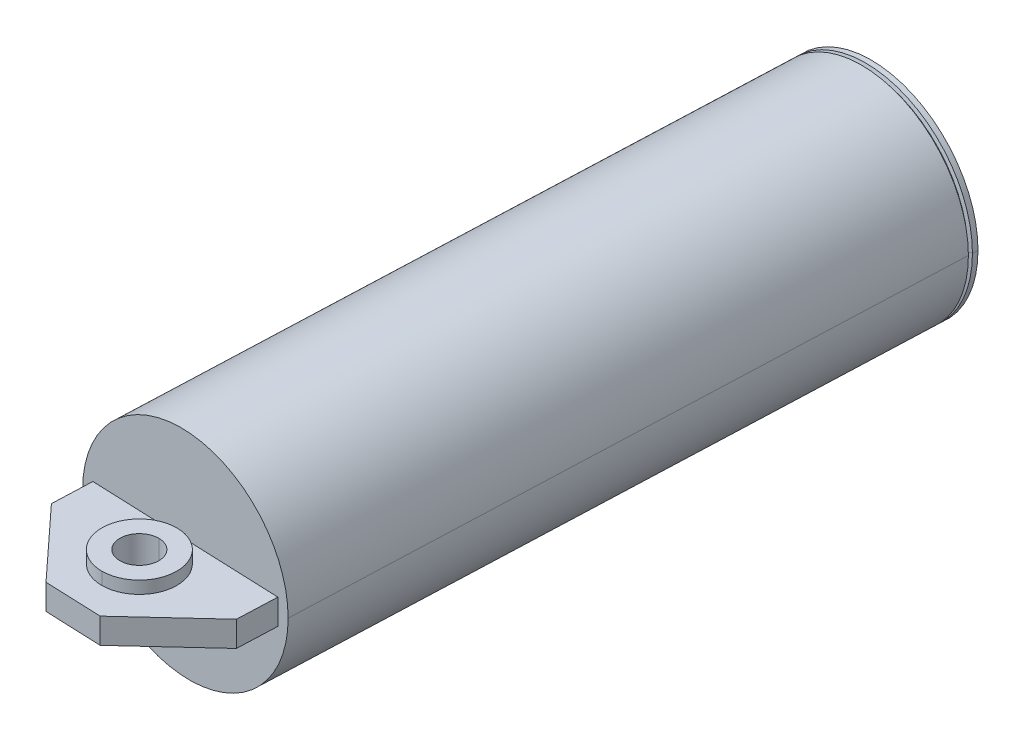
ISO-10303-21;
HEADER;
FILE_DESCRIPTION(('STEP AP214'),'2;1');
FILE_NAME('part.step','',(''),(''),'','','');
FILE_SCHEMA(('AUTOMOTIVE_DESIGN { 1 0 10303 214 1 1 1 1 }'));
ENDSEC;
DATA;
#1=APPLICATION_CONTEXT('core data for automotive mechanical design processes');
#2=APPLICATION_PROTOCOL_DEFINITION('international standard','automotive_design',2000,#1);
#3=PRODUCT_CONTEXT('',#1,'mechanical');
#4=PRODUCT('Part','Part','',(#3));
#5=PRODUCT_RELATED_PRODUCT_CATEGORY('part','',(#4));
#6=PRODUCT_DEFINITION_FORMATION('','',#4);
#7=PRODUCT_DEFINITION_CONTEXT('part definition',#1,'design');
#8=PRODUCT_DEFINITION('design','',#6,#7);
#9=PRODUCT_DEFINITION_SHAPE('','',#8);
#10=(LENGTH_UNIT() NAMED_UNIT(*) SI_UNIT(.MILLI.,.METRE.));
#11=(NAMED_UNIT(*) PLANE_ANGLE_UNIT() SI_UNIT($,.RADIAN.));
#12=(NAMED_UNIT(*) SI_UNIT($,.STERADIAN.) SOLID_ANGLE_UNIT());
#13=UNCERTAINTY_MEASURE_WITH_UNIT(LENGTH_MEASURE(1.E-05),#10,'distance_accuracy_value','');
#14=(GEOMETRIC_REPRESENTATION_CONTEXT(3) GLOBAL_UNCERTAINTY_ASSIGNED_CONTEXT((#13)) GLOBAL_UNIT_ASSIGNED_CONTEXT((#10,
#11,#12)) REPRESENTATION_CONTEXT('',''));
#15=CARTESIAN_POINT('',(0.,0.,0.));
#16=DIRECTION('',(0.,0.,1.));
#17=DIRECTION('',(1.,0.,0.));
#18=AXIS2_PLACEMENT_3D('',#15,#16,#17);
#19=CARTESIAN_POINT('',(328.520012892394,269.249999999995,1362.56665197064));
#20=DIRECTION('',(0.0397214660591929,0.,-0.999210791141743));
#21=DIRECTION('',(0.,-1.,0.));
#22=AXIS2_PLACEMENT_3D('',#19,#20,#21);
#23=PLANE('',#22);
#24=CARTESIAN_POINT('',(328.520012892394,269.249999999995,1362.56665197064));
#25=DIRECTION('',(0.0397214660591949,0.,-0.999210791141743));
#26=DIRECTION('',(0.999210791141743,0.,0.0397214660591949));
#27=AXIS2_PLACEMENT_3D('',#24,#25,#26);
#28=CIRCLE('',#27,50.);
#29=CARTESIAN_POINT('',(378.480552449482,269.249999999995,1364.5527252736));
#30=VERTEX_POINT('',#29);
#31=CARTESIAN_POINT('',(278.559473335308,269.249999999995,1360.58057866768));
#32=VERTEX_POINT('',#31);
#33=EDGE_CURVE('E362',#30,#32,#28,.T.);
#34=ORIENTED_EDGE('',*,*,#33,.T.);
#35=CARTESIAN_POINT('',(328.520012892394,269.249999999995,1362.56665197064));
#36=DIRECTION('',(0.0397214660591949,0.,-0.999210791141743));
#37=DIRECTION('',(0.999210791141743,0.,0.0397214660591949));
#38=AXIS2_PLACEMENT_3D('',#35,#36,#37);
#39=CIRCLE('',#38,50.);
#40=EDGE_CURVE('E9',#32,#30,#39,.T.);
#41=ORIENTED_EDGE('',*,*,#40,.T.);
#42=EDGE_LOOP('',(#34,#41));
#43=FACE_BOUND('',#42,.T.);
#44=ADVANCED_FACE('F16',(#43),#23,.T.);
#45=CARTESIAN_POINT('',(328.142658964832,269.249999999995,1372.05915448649));
#46=DIRECTION('',(-0.0397214660591949,0.,0.999210791141743));
#47=DIRECTION('',(0.999210791141743,0.,0.0397214660591949));
#48=AXIS2_PLACEMENT_3D('',#45,#46,#47);
#49=CYLINDRICAL_SURFACE('',#48,50.);
#50=DIRECTION('',(-0.0397214660591929,0.,0.999210791141743));
#51=VECTOR('',#50,1.);
#52=CARTESIAN_POINT('',(278.182119407745,269.249999999995,1370.07308118353));
#53=LINE('',#52,#51);
#54=CARTESIAN_POINT('',(278.74219207918,269.249999999995,1355.98420902843));
#55=VERTEX_POINT('',#54);
#56=EDGE_CURVE('E367',#55,#32,#53,.T.);
#57=ORIENTED_EDGE('',*,*,#56,.F.);
#58=CARTESIAN_POINT('',(328.702731636267,269.249999999995,1357.97028233139));
#59=DIRECTION('',(0.0397214660591949,0.,-0.999210791141743));
#60=DIRECTION('',(0.999210791141743,0.,0.0397214660591949));
#61=AXIS2_PLACEMENT_3D('',#58,#59,#60);
#62=CIRCLE('',#61,50.);
#63=CARTESIAN_POINT('',(378.663271193354,269.249999999995,1359.95635563435));
#64=VERTEX_POINT('',#63);
#65=EDGE_CURVE('E19',#55,#64,#62,.T.);
#66=ORIENTED_EDGE('',*,*,#65,.T.);
#67=DIRECTION('',(-0.0397214660591929,0.,0.999210791141743));
#68=VECTOR('',#67,1.);
#69=CARTESIAN_POINT('',(378.103198521919,269.249999999995,1374.04522778945));
#70=LINE('',#69,#68);
#71=EDGE_CURVE('E366',#64,#30,#70,.T.);
#72=ORIENTED_EDGE('',*,*,#71,.T.);
#73=ORIENTED_EDGE('',*,*,#40,.F.);
#74=EDGE_LOOP('',(#57,#66,#72,#73));
#75=FACE_BOUND('',#74,.T.);
#76=ADVANCED_FACE('F487',(#75),#49,.F.);
#77=CARTESIAN_POINT('',(356.218422899603,313.536711066785,1359.06410918584));
#78=DIRECTION('',(-0.0397214660591928,0.,0.999210791141743));
#79=DIRECTION('',(0.,1.,0.));
#80=AXIS2_PLACEMENT_3D('',#77,#78,#79);
#81=PLANE('',#80);
#82=CARTESIAN_POINT('',(328.702731636267,269.249999999995,1357.97028233139));
#83=DIRECTION('',(0.0397214660591949,0.,-0.999210791141743));
#84=DIRECTION('',(0.999210791141743,0.,0.0397214660591949));
#85=AXIS2_PLACEMENT_3D('',#82,#83,#84);
#86=CIRCLE('',#85,50.);
#87=EDGE_CURVE('E317',#64,#55,#86,.T.);
#88=ORIENTED_EDGE('',*,*,#87,.F.);
#89=ORIENTED_EDGE('',*,*,#65,.F.);
#90=EDGE_LOOP('',(#88,#89));
#91=FACE_BOUND('',#90,.T.);
#92=CARTESIAN_POINT('',(328.702731636267,269.249999999995,1357.97028233139));
#93=DIRECTION('',(0.0397214660591948,0.,-0.999210791141743));
#94=DIRECTION('',(0.999210791141743,0.,0.0397214660591948));
#95=AXIS2_PLACEMENT_3D('',#92,#93,#94);
#96=CIRCLE('',#95,52.15);
#97=CARTESIAN_POINT('',(380.811574394309,269.249999999995,1360.04175678637));
#98=VERTEX_POINT('',#97);
#99=CARTESIAN_POINT('',(276.593888878225,269.249999999995,1355.8988078764));
#100=VERTEX_POINT('',#99);
#101=EDGE_CURVE('E318',#98,#100,#96,.T.);
#102=ORIENTED_EDGE('',*,*,#101,.T.);
#103=CARTESIAN_POINT('',(328.702731636267,269.249999999995,1357.97028233139));
#104=DIRECTION('',(0.0397214660591948,0.,-0.999210791141743));
#105=DIRECTION('',(0.999210791141743,0.,0.0397214660591948));
#106=AXIS2_PLACEMENT_3D('',#103,#104,#105);
#107=CIRCLE('',#106,52.15);
#108=EDGE_CURVE('E476',#100,#98,#107,.T.);
#109=ORIENTED_EDGE('',*,*,#108,.T.);
#110=EDGE_LOOP('',(#102,#109));
#111=FACE_BOUND('',#110,.T.);
#112=ADVANCED_FACE('F493',(#91,#111),#81,.F.);
#113=CARTESIAN_POINT('',(328.142658964832,269.249999999995,1372.05915448649));
#114=DIRECTION('',(-0.0397214660591948,0.,0.999210791141743));
#115=DIRECTION('',(0.999210791141743,0.,0.0397214660591948));
#116=AXIS2_PLACEMENT_3D('',#113,#114,#115);
#117=CYLINDRICAL_SURFACE('',#116,52.15);
#118=DIRECTION('',(-0.0397214660591929,0.,0.999210791141743));
#119=VECTOR('',#118,1.);
#120=CARTESIAN_POINT('',(276.03381620679,269.249999999995,1369.9876800315));
#121=LINE('',#120,#119);
#122=CARTESIAN_POINT('',(276.709081129797,269.249999999995,1353.00109658209));
#123=VERTEX_POINT('',#122);
#124=EDGE_CURVE('E387',#123,#100,#121,.T.);
#125=ORIENTED_EDGE('',*,*,#124,.F.);
#126=CARTESIAN_POINT('',(328.817923887839,269.249999999995,1355.07257103708));
#127=DIRECTION('',(0.0397214660591948,0.,-0.999210791141743));
#128=DIRECTION('',(0.999210791141743,0.,0.0397214660591948));
#129=AXIS2_PLACEMENT_3D('',#126,#127,#128);
#130=CIRCLE('',#129,52.15);
#131=CARTESIAN_POINT('',(380.926766645881,269.249999999995,1357.14404549206));
#132=VERTEX_POINT('',#131);
#133=EDGE_CURVE('E473',#123,#132,#130,.T.);
#134=ORIENTED_EDGE('',*,*,#133,.T.);
#135=DIRECTION('',(-0.0397214660591929,0.,0.999210791141743));
#136=VECTOR('',#135,1.);
#137=CARTESIAN_POINT('',(380.251501722874,269.249999999995,1374.13062894147));
#138=LINE('',#137,#136);
#139=EDGE_CURVE('E313',#132,#98,#138,.T.);
#140=ORIENTED_EDGE('',*,*,#139,.T.);
#141=ORIENTED_EDGE('',*,*,#108,.F.);
#142=EDGE_LOOP('',(#125,#134,#140,#141));
#143=FACE_BOUND('',#142,.T.);
#144=ADVANCED_FACE('F495',(#143),#117,.F.);
#145=CARTESIAN_POINT('',(355.726845353421,312.56011053511,1356.14227706924));
#146=DIRECTION('',(0.0397214660591928,0.,-0.999210791141743));
#147=DIRECTION('',(0.,-1.,0.));
#148=AXIS2_PLACEMENT_3D('',#145,#146,#147);
#149=PLANE('',#148);
#150=CARTESIAN_POINT('',(328.817923887839,269.249999999995,1355.07257103708));
#151=DIRECTION('',(0.0397214660591914,0.,-0.999210791141743));
#152=DIRECTION('',(0.999210791141743,0.,0.0397214660591914));
#153=AXIS2_PLACEMENT_3D('',#150,#151,#152);
#154=CIRCLE('',#153,51.);
#155=CARTESIAN_POINT('',(379.777674236068,269.249999999995,1357.0983658061));
#156=VERTEX_POINT('',#155);
#157=CARTESIAN_POINT('',(277.85817353961,269.249999999995,1353.04677626806));
#158=VERTEX_POINT('',#157);
#159=EDGE_CURVE('E378',#156,#158,#154,.T.);
#160=ORIENTED_EDGE('',*,*,#159,.T.);
#161=CARTESIAN_POINT('',(328.817923887839,269.249999999995,1355.07257103708));
#162=DIRECTION('',(0.0397214660591914,0.,-0.999210791141743));
#163=DIRECTION('',(0.999210791141743,0.,0.0397214660591914));
#164=AXIS2_PLACEMENT_3D('',#161,#162,#163);
#165=CIRCLE('',#164,51.);
#166=EDGE_CURVE('E470',#158,#156,#165,.T.);
#167=ORIENTED_EDGE('',*,*,#166,.T.);
#168=EDGE_LOOP('',(#160,#167));
#169=FACE_BOUND('',#168,.T.);
#170=CARTESIAN_POINT('',(328.817923887839,269.249999999995,1355.07257103708));
#171=DIRECTION('',(0.0397214660591948,0.,-0.999210791141743));
#172=DIRECTION('',(0.999210791141743,0.,0.0397214660591948));
#173=AXIS2_PLACEMENT_3D('',#170,#171,#172);
#174=CIRCLE('',#173,52.15);
#175=EDGE_CURVE('E383',#132,#123,#174,.T.);
#176=ORIENTED_EDGE('',*,*,#175,.F.);
#177=ORIENTED_EDGE('',*,*,#133,.F.);
#178=EDGE_LOOP('',(#176,#177));
#179=FACE_BOUND('',#178,.T.);
#180=ADVANCED_FACE('F505',(#169,#179),#149,.F.);
#181=CARTESIAN_POINT('',(300.000000261894,243.999999999992,2080.00000001041));
#182=DIRECTION('',(0.,-1.,0.));
#183=DIRECTION('',(0.,0.,-1.));
#184=AXIS2_PLACEMENT_3D('',#181,#182,#183);
#185=PLANE('',#184);
#186=CARTESIAN_POINT('',(300.000000261894,243.999999999992,2080.00000001041));
#187=DIRECTION('',(0.,1.,0.));
#188=DIRECTION('',(0.,0.,-1.));
#189=AXIS2_PLACEMENT_3D('',#186,#187,#188);
#190=CIRCLE('',#189,20.);
#191=CARTESIAN_POINT('',(300.000000261894,243.999999999993,2060.00000001041));
#192=VERTEX_POINT('',#191);
#193=CARTESIAN_POINT('',(300.000000261894,243.999999999992,2100.00000001041));
#194=VERTEX_POINT('',#193);
#195=EDGE_CURVE('E346',#192,#194,#190,.T.);
#196=ORIENTED_EDGE('',*,*,#195,.T.);
#197=CARTESIAN_POINT('',(300.000000261894,243.999999999992,2080.00000001041));
#198=DIRECTION('',(0.,1.,0.));
#199=DIRECTION('',(0.,0.,-1.));
#200=AXIS2_PLACEMENT_3D('',#197,#198,#199);
#201=CIRCLE('',#200,20.);
#202=EDGE_CURVE('E394',#194,#192,#201,.T.);
#203=ORIENTED_EDGE('',*,*,#202,.T.);
#204=EDGE_LOOP('',(#196,#203));
#205=FACE_BOUND('',#204,.T.);
#206=CARTESIAN_POINT('',(300.000000261894,243.999999999992,2080.00000001041));
#207=DIRECTION('',(0.,1.,0.));
#208=DIRECTION('',(0.,0.,1.));
#209=AXIS2_PLACEMENT_3D('',#206,#207,#208);
#210=CIRCLE('',#209,27.5);
#211=CARTESIAN_POINT('',(300.000000261894,243.999999999992,2107.50000001041));
#212=VERTEX_POINT('',#211);
#213=CARTESIAN_POINT('',(300.000000261894,243.999999999993,2052.50000001041));
#214=VERTEX_POINT('',#213);
#215=EDGE_CURVE('E327',#212,#214,#210,.T.);
#216=ORIENTED_EDGE('',*,*,#215,.F.);
#217=CARTESIAN_POINT('',(300.000000261894,243.999999999992,2080.00000001041));
#218=DIRECTION('',(0.,1.,0.));
#219=DIRECTION('',(0.,0.,1.));
#220=AXIS2_PLACEMENT_3D('',#217,#218,#219);
#221=CIRCLE('',#220,27.5);
#222=EDGE_CURVE('E474',#214,#212,#221,.T.);
#223=ORIENTED_EDGE('',*,*,#222,.F.);
#224=EDGE_LOOP('',(#216,#223));
#225=FACE_BOUND('',#224,.T.);
#226=ADVANCED_FACE('F507',(#205,#225),#185,.T.);
#227=CARTESIAN_POINT('',(328.142658964832,269.249999999995,1372.05915448649));
#228=DIRECTION('',(-0.0397214660591914,0.,0.999210791141743));
#229=DIRECTION('',(0.999210791141743,0.,0.0397214660591914));
#230=AXIS2_PLACEMENT_3D('',#227,#228,#229);
#231=CYLINDRICAL_SURFACE('',#230,51.);
#232=DIRECTION('',(-0.0397214660591929,0.,0.999210791141743));
#233=VECTOR('',#232,1.);
#234=CARTESIAN_POINT('',(277.182908616603,269.249999999995,1370.03335971747));
#235=LINE('',#234,#233);
#236=CARTESIAN_POINT('',(277.937616471728,269.249999999995,1351.04835468577));
#237=VERTEX_POINT('',#236);
#238=EDGE_CURVE('E371',#237,#158,#235,.T.);
#239=ORIENTED_EDGE('',*,*,#238,.F.);
#240=CARTESIAN_POINT('',(328.897366819957,269.249999999995,1353.07414945479));
#241=DIRECTION('',(0.0397214660591914,0.,-0.999210791141743));
#242=DIRECTION('',(0.999210791141743,0.,0.0397214660591914));
#243=AXIS2_PLACEMENT_3D('',#240,#241,#242);
#244=CIRCLE('',#243,51.);
#245=CARTESIAN_POINT('',(379.857117168186,269.249999999995,1355.09994422381));
#246=VERTEX_POINT('',#245);
#247=EDGE_CURVE('E391',#237,#246,#244,.T.);
#248=ORIENTED_EDGE('',*,*,#247,.T.);
#249=DIRECTION('',(-0.0397214660591929,0.,0.999210791141743));
#250=VECTOR('',#249,1.);
#251=CARTESIAN_POINT('',(379.102409313061,269.249999999995,1374.0849492555));
#252=LINE('',#251,#250);
#253=EDGE_CURVE('E379',#246,#156,#252,.T.);
#254=ORIENTED_EDGE('',*,*,#253,.T.);
#255=ORIENTED_EDGE('',*,*,#166,.F.);
#256=EDGE_LOOP('',(#239,#248,#254,#255));
#257=FACE_BOUND('',#256,.T.);
#258=ADVANCED_FACE('F515',(#257),#231,.F.);
#259=CARTESIAN_POINT('',(300.000000261894,243.999999999992,2080.00000001041));
#260=DIRECTION('',(0.,1.,0.));
#261=DIRECTION('',(0.,0.,1.));
#262=AXIS2_PLACEMENT_3D('',#259,#260,#261);
#263=CYLINDRICAL_SURFACE('',#262,27.5);
#264=DIRECTION('',(0.,1.,0.));
#265=VECTOR('',#264,1.);
#266=CARTESIAN_POINT('',(300.000000261894,243.999999999993,2052.50000001041));
#267=LINE('',#266,#265);
#268=CARTESIAN_POINT('',(300.000000261894,248.999999999993,2052.50000001041));
#269=VERTEX_POINT('',#268);
#270=EDGE_CURVE('E331',#214,#269,#267,.T.);
#271=ORIENTED_EDGE('',*,*,#270,.F.);
#272=ORIENTED_EDGE('',*,*,#222,.T.);
#273=DIRECTION('',(0.,1.,0.));
#274=VECTOR('',#273,1.);
#275=CARTESIAN_POINT('',(300.000000261894,243.999999999992,2107.50000001041));
#276=LINE('',#275,#274);
#277=CARTESIAN_POINT('',(300.000000261894,248.999999999992,2107.50000001041));
#278=VERTEX_POINT('',#277);
#279=EDGE_CURVE('E357',#212,#278,#276,.T.);
#280=ORIENTED_EDGE('',*,*,#279,.T.);
#281=CARTESIAN_POINT('',(300.000000261894,248.999999999993,2080.00000001041));
#282=DIRECTION('',(0.,1.,0.));
#283=DIRECTION('',(0.,0.,1.));
#284=AXIS2_PLACEMENT_3D('',#281,#282,#283);
#285=CIRCLE('',#284,27.5);
#286=EDGE_CURVE('E395',#269,#278,#285,.T.);
#287=ORIENTED_EDGE('',*,*,#286,.F.);
#288=EDGE_LOOP('',(#271,#272,#280,#287));
#289=FACE_BOUND('',#288,.T.);
#290=ADVANCED_FACE('F556',(#289),#263,.T.);
#291=CARTESIAN_POINT('',(300.000000261894,282.249999999993,2080.00000001041));
#292=DIRECTION('',(0.,-1.,0.));
#293=DIRECTION('',(0.,0.,-1.));
#294=AXIS2_PLACEMENT_3D('',#291,#292,#293);
#295=CYLINDRICAL_SURFACE('',#294,20.);
#296=DIRECTION('',(0.,-1.,0.));
#297=VECTOR('',#296,1.);
#298=CARTESIAN_POINT('',(300.000000261894,282.249999999993,2100.00000001041));
#299=LINE('',#298,#297);
#300=CARTESIAN_POINT('',(300.000000261894,294.999999999992,2100.00000001041));
#301=VERTEX_POINT('',#300);
#302=EDGE_CURVE('E342',#301,#194,#299,.T.);
#303=ORIENTED_EDGE('',*,*,#302,.F.);
#304=CARTESIAN_POINT('',(300.000000261894,294.999999999992,2080.00000001041));
#305=DIRECTION('',(0.,-1.,0.));
#306=DIRECTION('',(0.,0.,-1.));
#307=AXIS2_PLACEMENT_3D('',#304,#305,#306);
#308=CIRCLE('',#307,20.);
#309=CARTESIAN_POINT('',(300.000000261894,294.999999999993,2060.00000001041));
#310=VERTEX_POINT('',#309);
#311=EDGE_CURVE('E465',#310,#301,#308,.T.);
#312=ORIENTED_EDGE('',*,*,#311,.F.);
#313=DIRECTION('',(0.,-1.,0.));
#314=VECTOR('',#313,1.);
#315=CARTESIAN_POINT('',(300.000000261894,282.249999999993,2060.00000001041));
#316=LINE('',#315,#314);
#317=EDGE_CURVE('E332',#310,#192,#316,.T.);
#318=ORIENTED_EDGE('',*,*,#317,.T.);
#319=ORIENTED_EDGE('',*,*,#202,.F.);
#320=EDGE_LOOP('',(#303,#312,#318,#319));
#321=FACE_BOUND('',#320,.T.);
#322=ADVANCED_FACE('F554',(#321),#295,.F.);
#323=CARTESIAN_POINT('',(386.936217039841,362.663963899263,1355.38135854377));
#324=DIRECTION('',(-0.0397214660591928,0.,0.999210791141743));
#325=DIRECTION('',(0.,1.,0.));
#326=AXIS2_PLACEMENT_3D('',#323,#324,#325);
#327=PLANE('',#326);
#328=CARTESIAN_POINT('',(328.897366819957,269.249999999995,1353.07414945479));
#329=DIRECTION('',(0.0397214660591914,0.,-0.999210791141743));
#330=DIRECTION('',(0.999210791141743,0.,0.0397214660591914));
#331=AXIS2_PLACEMENT_3D('',#328,#329,#330);
#332=CIRCLE('',#331,51.);
#333=EDGE_CURVE('E361',#246,#237,#332,.T.);
#334=ORIENTED_EDGE('',*,*,#333,.F.);
#335=ORIENTED_EDGE('',*,*,#247,.F.);
#336=EDGE_LOOP('',(#334,#335));
#337=FACE_BOUND('',#336,.T.);
#338=CARTESIAN_POINT('',(328.897366819957,269.249999999995,1353.07414945479));
#339=DIRECTION('',(-0.0397214660591929,0.,0.999210791141743));
#340=DIRECTION('',(0.999210791141743,0.,0.0397214660591929));
#341=AXIS2_PLACEMENT_3D('',#338,#339,#340);
#342=CIRCLE('',#341,110.);
#343=CARTESIAN_POINT('',(438.810553845549,269.249999999995,1357.4435107213));
#344=VERTEX_POINT('',#343);
#345=CARTESIAN_POINT('',(218.984179794365,269.249999999995,1348.70478818828));
#346=VERTEX_POINT('',#345);
#347=EDGE_CURVE('E326',#344,#346,#342,.T.);
#348=ORIENTED_EDGE('',*,*,#347,.F.);
#349=CARTESIAN_POINT('',(328.897366819957,269.249999999995,1353.07414945479));
#350=DIRECTION('',(-0.0397214660591929,0.,0.999210791141743));
#351=DIRECTION('',(0.999210791141743,0.,0.0397214660591929));
#352=AXIS2_PLACEMENT_3D('',#349,#350,#351);
#353=CIRCLE('',#352,110.);
#354=EDGE_CURVE('E464',#346,#344,#353,.T.);
#355=ORIENTED_EDGE('',*,*,#354,.F.);
#356=EDGE_LOOP('',(#348,#355));
#357=FACE_BOUND('',#356,.T.);
#358=ADVANCED_FACE('F550',(#337,#357),#327,.F.);
#359=CARTESIAN_POINT('',(300.000000261894,248.999999999993,2080.00000001041));
#360=DIRECTION('',(0.,-1.,0.));
#361=DIRECTION('',(0.,0.,-1.));
#362=AXIS2_PLACEMENT_3D('',#359,#360,#361);
#363=PLANE('',#362);
#364=CARTESIAN_POINT('',(300.000000261894,248.999999999993,2080.00000001041));
#365=DIRECTION('',(0.,1.,0.));
#366=DIRECTION('',(0.,0.,1.));
#367=AXIS2_PLACEMENT_3D('',#364,#365,#366);
#368=CIRCLE('',#367,27.5);
#369=EDGE_CURVE('E353',#278,#269,#368,.T.);
#370=ORIENTED_EDGE('',*,*,#369,.T.);
#371=ORIENTED_EDGE('',*,*,#286,.T.);
#372=EDGE_LOOP('',(#370,#371));
#373=FACE_BOUND('',#372,.T.);
#374=CARTESIAN_POINT('',(300.000000261894,248.999999999993,2080.00000001041));
#375=DIRECTION('',(0.,1.,0.));
#376=DIRECTION('',(0.,0.,-1.));
#377=AXIS2_PLACEMENT_3D('',#374,#375,#376);
#378=CIRCLE('',#377,38.5);
#379=CARTESIAN_POINT('',(300.000000261894,248.999999999993,2041.50000001041));
#380=VERTEX_POINT('',#379);
#381=CARTESIAN_POINT('',(300.000000261894,248.999999999992,2118.50000001041));
#382=VERTEX_POINT('',#381);
#383=EDGE_CURVE('E461',#380,#382,#378,.T.);
#384=ORIENTED_EDGE('',*,*,#383,.F.);
#385=CARTESIAN_POINT('',(300.000000261894,248.999999999993,2080.00000001041));
#386=DIRECTION('',(0.,1.,0.));
#387=DIRECTION('',(0.,0.,-1.));
#388=AXIS2_PLACEMENT_3D('',#385,#386,#387);
#389=CIRCLE('',#388,38.5);
#390=EDGE_CURVE('E312',#382,#380,#389,.T.);
#391=ORIENTED_EDGE('',*,*,#390,.F.);
#392=EDGE_LOOP('',(#384,#391));
#393=FACE_BOUND('',#392,.T.);
#394=ADVANCED_FACE('F546',(#373,#393),#363,.T.);
#395=CARTESIAN_POINT('',(-0.0159418182665113,295.,0.401023386657021));
#396=DIRECTION('',(0.,1.,0.));
#397=DIRECTION('',(0.,0.,-1.));
#398=AXIS2_PLACEMENT_3D('',#395,#396,#397);
#399=PLANE('',#398);
#400=ORIENTED_EDGE('',*,*,#311,.T.);
#401=CARTESIAN_POINT('',(300.000000261894,294.999999999992,2080.00000001041));
#402=DIRECTION('',(0.,-1.,0.));
#403=DIRECTION('',(0.,0.,-1.));
#404=AXIS2_PLACEMENT_3D('',#401,#402,#403);
#405=CIRCLE('',#404,20.);
#406=EDGE_CURVE('E301',#301,#310,#405,.T.);
#407=ORIENTED_EDGE('',*,*,#406,.T.);
#408=EDGE_LOOP('',(#400,#407));
#409=FACE_BOUND('',#408,.T.);
#410=CARTESIAN_POINT('',(300.000000261894,294.999999999992,2080.00000001041));
#411=DIRECTION('',(0.,-1.,0.));
#412=DIRECTION('',(0.,0.,-1.));
#413=AXIS2_PLACEMENT_3D('',#410,#411,#412);
#414=CIRCLE('',#413,38.5);
#415=CARTESIAN_POINT('',(300.000000261894,294.999999999993,2041.50000001041));
#416=VERTEX_POINT('',#415);
#417=CARTESIAN_POINT('',(300.000000261894,294.999999999992,2118.50000001041));
#418=VERTEX_POINT('',#417);
#419=EDGE_CURVE('E282',#416,#418,#414,.T.);
#420=ORIENTED_EDGE('',*,*,#419,.F.);
#421=CARTESIAN_POINT('',(300.000000261894,294.999999999992,2080.00000001041));
#422=DIRECTION('',(0.,-1.,0.));
#423=DIRECTION('',(0.,0.,-1.));
#424=AXIS2_PLACEMENT_3D('',#421,#422,#423);
#425=CIRCLE('',#424,38.5);
#426=EDGE_CURVE('E460',#418,#416,#425,.T.);
#427=ORIENTED_EDGE('',*,*,#426,.F.);
#428=EDGE_LOOP('',(#420,#427));
#429=FACE_BOUND('',#428,.T.);
#430=ADVANCED_FACE('F543',(#409,#429),#399,.T.);
#431=CARTESIAN_POINT('',(328.142658964832,269.249999999995,1372.05915448649));
#432=DIRECTION('',(-0.0397214660591929,0.,0.999210791141743));
#433=DIRECTION('',(0.999210791141743,0.,0.0397214660591929));
#434=AXIS2_PLACEMENT_3D('',#431,#432,#433);
#435=CYLINDRICAL_SURFACE('',#434,110.);
#436=DIRECTION('',(-0.0397214660591929,0.,0.999210791141743));
#437=VECTOR('',#436,1.);
#438=CARTESIAN_POINT('',(218.229471939241,269.249999999995,1367.68979321997));
#439=LINE('',#438,#437);
#440=CARTESIAN_POINT('',(218.765902770303,269.249999999995,1354.19564186362));
#441=VERTEX_POINT('',#440);
#442=EDGE_CURVE('E302',#346,#441,#439,.T.);
#443=ORIENTED_EDGE('',*,*,#442,.F.);
#444=ORIENTED_EDGE('',*,*,#354,.T.);
#445=DIRECTION('',(-0.0397214660591929,0.,0.999210791141743));
#446=VECTOR('',#445,1.);
#447=CARTESIAN_POINT('',(438.055845990424,269.249999999995,1376.428515753));
#448=LINE('',#447,#446);
#449=CARTESIAN_POINT('',(438.592276821487,269.249999999995,1362.93436439664));
#450=VERTEX_POINT('',#449);
#451=EDGE_CURVE('E297',#344,#450,#448,.T.);
#452=ORIENTED_EDGE('',*,*,#451,.T.);
#453=CARTESIAN_POINT('',(328.679089795895,269.249999999995,1358.56500313013));
#454=DIRECTION('',(-0.0397214660591928,0.,0.999210791141743));
#455=DIRECTION('',(-0.999210791141743,0.,-0.0397214660591928));
#456=AXIS2_PLACEMENT_3D('',#453,#454,#455);
#457=CIRCLE('',#456,110.);
#458=EDGE_CURVE('E241',#441,#450,#457,.T.);
#459=ORIENTED_EDGE('',*,*,#458,.F.);
#460=EDGE_LOOP('',(#443,#444,#452,#459));
#461=FACE_BOUND('',#460,.T.);
#462=ADVANCED_FACE('F541',(#461),#435,.T.);
#463=CARTESIAN_POINT('',(300.000000261894,416.644444302721,2080.00000001041));
#464=DIRECTION('',(0.,-1.,0.));
#465=DIRECTION('',(0.,0.,-1.));
#466=AXIS2_PLACEMENT_3D('',#463,#464,#465);
#467=CYLINDRICAL_SURFACE('',#466,38.5);
#468=DIRECTION('',(0.,-1.,0.));
#469=VECTOR('',#468,1.);
#470=CARTESIAN_POINT('',(300.000000261894,416.644444302721,2118.50000001041));
#471=LINE('',#470,#469);
#472=CARTESIAN_POINT('',(300.000000261894,256.249999999992,2118.50000001041));
#473=VERTEX_POINT('',#472);
#474=EDGE_CURVE('E294',#473,#382,#471,.T.);
#475=ORIENTED_EDGE('',*,*,#474,.F.);
#476=CARTESIAN_POINT('',(300.000000261894,256.249999999992,2080.00000001041));
#477=DIRECTION('',(0.,-1.,0.));
#478=DIRECTION('',(0.,0.,-1.));
#479=AXIS2_PLACEMENT_3D('',#476,#477,#478);
#480=CIRCLE('',#479,38.5);
#481=CARTESIAN_POINT('',(300.000000261894,256.249999999993,2041.50000001041));
#482=VERTEX_POINT('',#481);
#483=EDGE_CURVE('E374',#473,#482,#480,.T.);
#484=ORIENTED_EDGE('',*,*,#483,.T.);
#485=DIRECTION('',(0.,-1.,0.));
#486=VECTOR('',#485,1.);
#487=CARTESIAN_POINT('',(300.000000261894,416.644444302721,2041.50000001041));
#488=LINE('',#487,#486);
#489=EDGE_CURVE('E322',#482,#380,#488,.T.);
#490=ORIENTED_EDGE('',*,*,#489,.T.);
#491=ORIENTED_EDGE('',*,*,#383,.T.);
#492=EDGE_LOOP('',(#475,#484,#490,#491));
#493=FACE_BOUND('',#492,.T.);
#494=ADVANCED_FACE('F537',(#493),#467,.T.);
#495=CARTESIAN_POINT('',(300.000000261894,416.644444302721,2080.00000001041));
#496=DIRECTION('',(0.,-1.,0.));
#497=DIRECTION('',(0.,0.,-1.));
#498=AXIS2_PLACEMENT_3D('',#495,#496,#497);
#499=CYLINDRICAL_SURFACE('',#498,38.5);
#500=DIRECTION('',(0.,-1.,0.));
#501=VECTOR('',#500,1.);
#502=CARTESIAN_POINT('',(300.000000261894,416.644444302721,2118.50000001041));
#503=LINE('',#502,#501);
#504=CARTESIAN_POINT('',(300.000000261894,282.249999999992,2118.50000001041));
#505=VERTEX_POINT('',#504);
#506=EDGE_CURVE('E286',#418,#505,#503,.T.);
#507=ORIENTED_EDGE('',*,*,#506,.F.);
#508=ORIENTED_EDGE('',*,*,#426,.T.);
#509=DIRECTION('',(0.,-1.,0.));
#510=VECTOR('',#509,1.);
#511=CARTESIAN_POINT('',(300.000000261894,416.644444302721,2041.50000001041));
#512=LINE('',#511,#510);
#513=CARTESIAN_POINT('',(300.000000261894,282.249999999993,2041.50000001041));
#514=VERTEX_POINT('',#513);
#515=EDGE_CURVE('E295',#416,#514,#512,.T.);
#516=ORIENTED_EDGE('',*,*,#515,.T.);
#517=CARTESIAN_POINT('',(300.000000261894,282.249999999993,2080.00000001041));
#518=DIRECTION('',(0.,-1.,0.));
#519=DIRECTION('',(0.,0.,-1.));
#520=AXIS2_PLACEMENT_3D('',#517,#518,#519);
#521=CIRCLE('',#520,38.5);
#522=EDGE_CURVE('E432',#505,#514,#521,.T.);
#523=ORIENTED_EDGE('',*,*,#522,.F.);
#524=EDGE_LOOP('',(#507,#508,#516,#523));
#525=FACE_BOUND('',#524,.T.);
#526=ADVANCED_FACE('F534',(#525),#499,.T.);
#527=CARTESIAN_POINT('',(201.256878536128,282.249999999993,2071.57112631041));
#528=DIRECTION('',(-0.734636044260227,0.,0.678461408241976));
#529=DIRECTION('',(0.,1.,0.));
#530=AXIS2_PLACEMENT_3D('',#527,#528,#529);
#531=PLANE('',#530);
#532=DIRECTION('',(0.678461408241976,0.,0.734636044260227));
#533=VECTOR('',#532,1.);
#534=CARTESIAN_POINT('',(201.256878536128,282.249999999993,2071.57112631041));
#535=LINE('',#534,#533);
#536=CARTESIAN_POINT('',(201.256878536128,282.249999999993,2071.57112631041));
#537=VERTEX_POINT('',#536);
#538=CARTESIAN_POINT('',(268.421131291906,282.249999999992,2144.29638431448));
#539=VERTEX_POINT('',#538);
#540=EDGE_CURVE('E433',#537,#539,#535,.T.);
#541=ORIENTED_EDGE('',*,*,#540,.F.);
#542=DIRECTION('',(0.,1.,0.));
#543=VECTOR('',#542,1.);
#544=CARTESIAN_POINT('',(201.256878536128,282.249999999993,2071.57112631041));
#545=LINE('',#544,#543);
#546=CARTESIAN_POINT('',(201.256878536128,256.249999999993,2071.57112631041));
#547=VERTEX_POINT('',#546);
#548=EDGE_CURVE('E39',#547,#537,#545,.T.);
#549=ORIENTED_EDGE('',*,*,#548,.F.);
#550=DIRECTION('',(0.678461408241976,0.,0.734636044260227));
#551=VECTOR('',#550,1.);
#552=CARTESIAN_POINT('',(201.256878536128,256.249999999993,2071.57112631041));
#553=LINE('',#552,#551);
#554=CARTESIAN_POINT('',(268.421131291906,256.249999999992,2144.29638431448));
#555=VERTEX_POINT('',#554);
#556=EDGE_CURVE('E249',#547,#555,#553,.T.);
#557=ORIENTED_EDGE('',*,*,#556,.T.);
#558=DIRECTION('',(0.,-1.,0.));
#559=VECTOR('',#558,1.);
#560=CARTESIAN_POINT('',(268.421131291906,282.249999999992,2144.29638431448));
#561=LINE('',#560,#559);
#562=EDGE_CURVE('E240',#539,#555,#561,.T.);
#563=ORIENTED_EDGE('',*,*,#562,.F.);
#564=EDGE_LOOP('',(#541,#549,#557,#563));
#565=FACE_BOUND('',#564,.T.);
#566=ADVANCED_FACE('F533',(#565),#531,.T.);
#567=CARTESIAN_POINT('',(268.421131291906,282.249999999992,2144.29638431448));
#568=DIRECTION('',(-0.0397214660591934,0.,0.999210791141743));
#569=DIRECTION('',(0.,1.,0.));
#570=AXIS2_PLACEMENT_3D('',#567,#568,#569);
#571=PLANE('',#570);
#572=DIRECTION('',(0.999210791141743,0.,0.0397214660591934));
#573=VECTOR('',#572,1.);
#574=CARTESIAN_POINT('',(268.421131291906,282.249999999992,2144.29638431448));
#575=LINE('',#574,#573);
#576=CARTESIAN_POINT('',(326.375357178128,282.249999999992,2146.60022934592));
#577=VERTEX_POINT('',#576);
#578=EDGE_CURVE('E429',#539,#577,#575,.T.);
#579=ORIENTED_EDGE('',*,*,#578,.F.);
#580=ORIENTED_EDGE('',*,*,#562,.T.);
#581=DIRECTION('',(0.999210791141743,0.,0.0397214660591934));
#582=VECTOR('',#581,1.);
#583=CARTESIAN_POINT('',(268.421131291906,256.249999999992,2144.29638431448));
#584=LINE('',#583,#582);
#585=CARTESIAN_POINT('',(326.375357178128,256.249999999992,2146.60022934592));
#586=VERTEX_POINT('',#585);
#587=EDGE_CURVE('E244',#555,#586,#584,.T.);
#588=ORIENTED_EDGE('',*,*,#587,.T.);
#589=DIRECTION('',(0.,-1.,0.));
#590=VECTOR('',#589,1.);
#591=CARTESIAN_POINT('',(326.375357178128,282.249999999992,2146.60022934592));
#592=LINE('',#591,#590);
#593=EDGE_CURVE('E228',#577,#586,#592,.T.);
#594=ORIENTED_EDGE('',*,*,#593,.F.);
#595=EDGE_LOOP('',(#579,#580,#588,#594));
#596=FACE_BOUND('',#595,.T.);
#597=ADVANCED_FACE('F245',(#596),#571,.T.);
#598=CARTESIAN_POINT('',(326.375357178128,282.249999999992,2146.60022934592));
#599=DIRECTION('',(0.678461408241978,0.,0.734636044260225));
#600=DIRECTION('',(0.,-1.,0.));
#601=AXIS2_PLACEMENT_3D('',#598,#599,#600);
#602=PLANE('',#601);
#603=DIRECTION('',(0.734636044260225,0.,-0.678461408241978));
#604=VECTOR('',#603,1.);
#605=CARTESIAN_POINT('',(326.375357178128,282.249999999992,2146.60022934592));
#606=LINE('',#605,#604);
#607=CARTESIAN_POINT('',(399.100615182193,282.249999999993,2079.43597659013));
#608=VERTEX_POINT('',#607);
#609=EDGE_CURVE('E235',#577,#608,#606,.T.);
#610=ORIENTED_EDGE('',*,*,#609,.F.);
#611=ORIENTED_EDGE('',*,*,#593,.T.);
#612=DIRECTION('',(0.734636044260225,0.,-0.678461408241978));
#613=VECTOR('',#612,1.);
#614=CARTESIAN_POINT('',(326.375357178128,256.249999999992,2146.60022934592));
#615=LINE('',#614,#613);
#616=CARTESIAN_POINT('',(399.100615182193,256.249999999992,2079.43597659013));
#617=VERTEX_POINT('',#616);
#618=EDGE_CURVE('E232',#586,#617,#615,.T.);
#619=ORIENTED_EDGE('',*,*,#618,.T.);
#620=DIRECTION('',(0.,-1.,0.));
#621=VECTOR('',#620,1.);
#622=CARTESIAN_POINT('',(399.100615182193,282.249999999993,2079.43597659013));
#623=LINE('',#622,#621);
#624=EDGE_CURVE('E261',#608,#617,#623,.T.);
#625=ORIENTED_EDGE('',*,*,#624,.F.);
#626=EDGE_LOOP('',(#610,#611,#619,#625));
#627=FACE_BOUND('',#626,.T.);
#628=ADVANCED_FACE('F230',(#627),#602,.T.);
#629=CARTESIAN_POINT('',(328.679089795895,269.249999999995,1358.56500313013));
#630=DIRECTION('',(0.039721466059191,0.,-0.999210791141743));
#631=DIRECTION('',(-0.999210791141743,0.,-0.039721466059191));
#632=AXIS2_PLACEMENT_3D('',#629,#630,#631);
#633=CONICAL_SURFACE('',#632,110.,1.30899693899568);
#634=DIRECTION('',(0.975444180986039,0.,-0.220246792894871));
#635=VECTOR('',#634,1.);
#636=CARTESIAN_POINT('',(438.592276821487,269.249999999995,1362.93436439664));
#637=LINE('',#636,#635);
#638=CARTESIAN_POINT('',(434.805323849382,269.249999999995,1363.789425366));
#639=VERTEX_POINT('',#638);
#640=EDGE_CURVE('E267',#639,#450,#637,.T.);
#641=ORIENTED_EDGE('',*,*,#640,.F.);
#642=CARTESIAN_POINT('',(328.639177290572,269.249999999995,1359.56901959721));
#643=DIRECTION('',(-0.0397214660591938,0.,0.999210791141743));
#644=DIRECTION('',(0.999210791141743,0.,0.0397214660591938));
#645=AXIS2_PLACEMENT_3D('',#642,#643,#644);
#646=CIRCLE('',#645,106.25);
#647=CARTESIAN_POINT('',(222.473030731762,269.249999999995,1355.34861382842));
#648=VERTEX_POINT('',#647);
#649=EDGE_CURVE('E280',#648,#639,#646,.T.);
#650=ORIENTED_EDGE('',*,*,#649,.F.);
#651=DIRECTION('',(-0.954882837155009,0.,-0.296982772744146));
#652=VECTOR('',#651,1.);
#653=CARTESIAN_POINT('',(218.765902770304,269.249999999995,1354.19564186362));
#654=LINE('',#653,#652);
#655=EDGE_CURVE('E275',#648,#441,#654,.T.);
#656=ORIENTED_EDGE('',*,*,#655,.T.);
#657=ORIENTED_EDGE('',*,*,#458,.T.);
#658=EDGE_LOOP('',(#641,#650,#656,#657));
#659=FACE_BOUND('',#658,.T.);
#660=ADVANCED_FACE('F669',(#659),#633,.T.);
#661=CARTESIAN_POINT('',(202.885458644555,282.249999999993,2030.60348387361));
#662=DIRECTION('',(-0.999210791141743,0.,-0.0397214660591933));
#663=DIRECTION('',(-0.0397214660591933,0.,0.999210791141743));
#664=AXIS2_PLACEMENT_3D('',#661,#662,#663);
#665=PLANE('',#664);
#666=DIRECTION('',(-0.0397214660591932,0.,0.999210791141743));
#667=VECTOR('',#666,1.);
#668=CARTESIAN_POINT('',(202.885458644555,282.249999999993,2030.60348387361));
#669=LINE('',#668,#667);
#670=CARTESIAN_POINT('',(202.885458644555,282.249999999993,2030.60348387361));
#671=VERTEX_POINT('',#670);
#672=EDGE_CURVE('E443',#671,#537,#669,.T.);
#673=ORIENTED_EDGE('',*,*,#672,.F.);
#674=DIRECTION('',(0.,-1.,0.));
#675=VECTOR('',#674,1.);
#676=CARTESIAN_POINT('',(202.885458644555,269.249999999993,2030.60348387361));
#677=LINE('',#676,#675);
#678=CARTESIAN_POINT('',(202.885458644557,256.249999999993,2030.60348387361));
#679=VERTEX_POINT('',#678);
#680=EDGE_CURVE('E281',#671,#679,#677,.T.);
#681=ORIENTED_EDGE('',*,*,#680,.T.);
#682=DIRECTION('',(-0.0397214660593771,0.,0.999210791141736));
#683=VECTOR('',#682,1.);
#684=CARTESIAN_POINT('',(202.885458644563,256.249999999993,2030.60348387361));
#685=LINE('',#684,#683);
#686=EDGE_CURVE('E404',#679,#547,#685,.T.);
#687=ORIENTED_EDGE('',*,*,#686,.T.);
#688=ORIENTED_EDGE('',*,*,#548,.T.);
#689=EDGE_LOOP('',(#673,#681,#687,#688));
#690=FACE_BOUND('',#689,.T.);
#691=ADVANCED_FACE('F648',(#690),#665,.T.);
#692=CARTESIAN_POINT('',(-0.0159418182665128,256.25,0.401023386656882));
#693=DIRECTION('',(0.,1.,0.));
#694=DIRECTION('',(0.,0.,-1.));
#695=AXIS2_PLACEMENT_3D('',#692,#693,#694);
#696=PLANE('',#695);
#697=CARTESIAN_POINT('',(300.000000261894,256.249999999992,2080.00000001041));
#698=DIRECTION('',(0.,-1.,0.));
#699=DIRECTION('',(0.,0.,-1.));
#700=AXIS2_PLACEMENT_3D('',#697,#698,#699);
#701=CIRCLE('',#700,38.5);
#702=EDGE_CURVE('E291',#482,#473,#701,.T.);
#703=ORIENTED_EDGE('',*,*,#702,.F.);
#704=ORIENTED_EDGE('',*,*,#483,.F.);
#705=EDGE_LOOP('',(#703,#704));
#706=FACE_BOUND('',#705,.T.);
#707=DIRECTION('',(0.0397214660591933,0.,-0.999210791141743));
#708=VECTOR('',#707,1.);
#709=CARTESIAN_POINT('',(399.100615182193,256.249999999993,2079.43597659013));
#710=LINE('',#709,#708);
#711=CARTESIAN_POINT('',(400.72919529062,256.249999999993,2038.46833415333));
#712=VERTEX_POINT('',#711);
#713=EDGE_CURVE('E253',#617,#712,#710,.T.);
#714=ORIENTED_EDGE('',*,*,#713,.F.);
#715=ORIENTED_EDGE('',*,*,#618,.F.);
#716=ORIENTED_EDGE('',*,*,#587,.F.);
#717=ORIENTED_EDGE('',*,*,#556,.F.);
#718=ORIENTED_EDGE('',*,*,#686,.F.);
#719=DIRECTION('',(0.999210791141743,0.,0.0397214660591928));
#720=VECTOR('',#719,1.);
#721=CARTESIAN_POINT('',(301.807326967587,256.249999999993,2034.53590901347));
#722=LINE('',#721,#720);
#723=EDGE_CURVE('E422',#679,#712,#722,.T.);
#724=ORIENTED_EDGE('',*,*,#723,.T.);
#725=EDGE_LOOP('',(#714,#715,#716,#717,#718,#724));
#726=FACE_BOUND('',#725,.T.);
#727=ADVANCED_FACE('F251',(#706,#726),#696,.F.);
#728=CARTESIAN_POINT('',(399.100615182193,282.249999999993,2079.43597659013));
#729=DIRECTION('',(0.999210791141743,0.,0.0397214660591933));
#730=DIRECTION('',(0.,-1.,0.));
#731=AXIS2_PLACEMENT_3D('',#728,#729,#730);
#732=PLANE('',#731);
#733=DIRECTION('',(0.0397214660591923,0.,-0.999210791141743));
#734=VECTOR('',#733,1.);
#735=CARTESIAN_POINT('',(399.100615182193,282.249999999993,2079.43597659013));
#736=LINE('',#735,#734);
#737=CARTESIAN_POINT('',(400.72919529062,282.249999999993,2038.46833415333));
#738=VERTEX_POINT('',#737);
#739=EDGE_CURVE('E440',#608,#738,#736,.T.);
#740=ORIENTED_EDGE('',*,*,#739,.F.);
#741=ORIENTED_EDGE('',*,*,#624,.T.);
#742=ORIENTED_EDGE('',*,*,#713,.T.);
#743=DIRECTION('',(0.,1.,0.));
#744=VECTOR('',#743,1.);
#745=CARTESIAN_POINT('',(400.72919529062,269.249999999993,2038.46833415333));
#746=LINE('',#745,#744);
#747=EDGE_CURVE('E425',#712,#738,#746,.T.);
#748=ORIENTED_EDGE('',*,*,#747,.T.);
#749=EDGE_LOOP('',(#740,#741,#742,#748));
#750=FACE_BOUND('',#749,.T.);
#751=ADVANCED_FACE('F640',(#750),#732,.T.);
#752=CARTESIAN_POINT('',(-0.0159418182665128,282.25,0.40102338665697));
#753=DIRECTION('',(0.,1.,0.));
#754=DIRECTION('',(0.,0.,-1.));
#755=AXIS2_PLACEMENT_3D('',#752,#753,#754);
#756=PLANE('',#755);
#757=CARTESIAN_POINT('',(300.000000261894,282.249999999993,2080.00000001041));
#758=DIRECTION('',(0.,-1.,0.));
#759=DIRECTION('',(0.,0.,-1.));
#760=AXIS2_PLACEMENT_3D('',#757,#758,#759);
#761=CIRCLE('',#760,38.5);
#762=EDGE_CURVE('E290',#514,#505,#761,.T.);
#763=ORIENTED_EDGE('',*,*,#762,.T.);
#764=ORIENTED_EDGE('',*,*,#522,.T.);
#765=EDGE_LOOP('',(#763,#764));
#766=FACE_BOUND('',#765,.T.);
#767=ORIENTED_EDGE('',*,*,#609,.T.);
#768=ORIENTED_EDGE('',*,*,#739,.T.);
#769=DIRECTION('',(-0.999210791141743,0.,-0.0397214660591928));
#770=VECTOR('',#769,1.);
#771=CARTESIAN_POINT('',(301.807326967587,282.249999999993,2034.53590901347));
#772=LINE('',#771,#770);
#773=EDGE_CURVE('E276',#738,#671,#772,.T.);
#774=ORIENTED_EDGE('',*,*,#773,.T.);
#775=ORIENTED_EDGE('',*,*,#672,.T.);
#776=ORIENTED_EDGE('',*,*,#540,.T.);
#777=ORIENTED_EDGE('',*,*,#578,.T.);
#778=EDGE_LOOP('',(#767,#768,#774,#775,#776,#777));
#779=FACE_BOUND('',#778,.T.);
#780=ADVANCED_FACE('F636',(#766,#779),#756,.T.);
#781=CARTESIAN_POINT('',(328.142658964832,269.249999999995,1372.05915448649));
#782=DIRECTION('',(-0.0397214660591938,0.,0.999210791141743));
#783=DIRECTION('',(0.999210791141743,0.,0.0397214660591938));
#784=AXIS2_PLACEMENT_3D('',#781,#782,#783);
#785=CYLINDRICAL_SURFACE('',#784,106.25);
#786=DIRECTION('',(-0.0397214660591929,0.,0.999210791141743));
#787=VECTOR('',#786,1.);
#788=CARTESIAN_POINT('',(221.976512406022,269.249999999995,1367.8387487177));
#789=LINE('',#788,#787);
#790=CARTESIAN_POINT('',(222.353866333585,269.249999999995,1358.34624620185));
#791=VERTEX_POINT('',#790);
#792=EDGE_CURVE('E612',#648,#791,#789,.T.);
#793=ORIENTED_EDGE('',*,*,#792,.F.);
#794=ORIENTED_EDGE('',*,*,#649,.T.);
#795=DIRECTION('',(-0.0397214660591929,0.,0.999210791141743));
#796=VECTOR('',#795,1.);
#797=CARTESIAN_POINT('',(434.308805523643,269.249999999995,1376.27956025528));
#798=LINE('',#797,#796);
#799=CARTESIAN_POINT('',(434.686159451205,269.249999999995,1366.78705773943));
#800=VERTEX_POINT('',#799);
#801=EDGE_CURVE('E265',#639,#800,#798,.T.);
#802=ORIENTED_EDGE('',*,*,#801,.T.);
#803=CARTESIAN_POINT('',(328.520012892394,269.249999999995,1362.56665197064));
#804=DIRECTION('',(-0.0397214660591938,0.,0.999210791141743));
#805=DIRECTION('',(0.999210791141743,0.,0.0397214660591938));
#806=AXIS2_PLACEMENT_3D('',#803,#804,#805);
#807=CIRCLE('',#806,106.25);
#808=EDGE_CURVE('E418',#791,#800,#807,.T.);
#809=ORIENTED_EDGE('',*,*,#808,.F.);
#810=EDGE_LOOP('',(#793,#794,#802,#809));
#811=FACE_BOUND('',#810,.T.);
#812=ADVANCED_FACE('F639',(#811),#785,.T.);
#813=CARTESIAN_POINT('',(301.807326967587,269.249999999993,2034.53590901347));
#814=DIRECTION('',(0.0397214660591928,0.,-0.999210791141743));
#815=DIRECTION('',(0.,-1.,0.));
#816=AXIS2_PLACEMENT_3D('',#813,#814,#815);
#817=PLANE('',#816);
#818=ORIENTED_EDGE('',*,*,#747,.F.);
#819=ORIENTED_EDGE('',*,*,#723,.F.);
#820=ORIENTED_EDGE('',*,*,#680,.F.);
#821=ORIENTED_EDGE('',*,*,#773,.F.);
#822=EDGE_LOOP('',(#818,#819,#820,#821));
#823=FACE_BOUND('',#822,.T.);
#824=CARTESIAN_POINT('',(301.807326967587,269.249999999993,2034.53590901347));
#825=DIRECTION('',(0.0397214660591909,0.,-0.999210791141743));
#826=DIRECTION('',(-0.999210791141743,0.,-0.0397214660591909));
#827=AXIS2_PLACEMENT_3D('',#824,#825,#826);
#828=CIRCLE('',#827,110.);
#829=CARTESIAN_POINT('',(191.894139941995,269.249999999993,2030.16654774695));
#830=VERTEX_POINT('',#829);
#831=CARTESIAN_POINT('',(411.720513993179,269.249999999993,2038.90527027997));
#832=VERTEX_POINT('',#831);
#833=EDGE_CURVE('E589',#830,#832,#828,.T.);
#834=ORIENTED_EDGE('',*,*,#833,.F.);
#835=CARTESIAN_POINT('',(301.807326967587,269.249999999993,2034.53590901347));
#836=DIRECTION('',(0.0397214660591909,0.,-0.999210791141743));
#837=DIRECTION('',(-0.999210791141743,0.,-0.0397214660591909));
#838=AXIS2_PLACEMENT_3D('',#835,#836,#837);
#839=CIRCLE('',#838,110.);
#840=EDGE_CURVE('E411',#832,#830,#839,.T.);
#841=ORIENTED_EDGE('',*,*,#840,.F.);
#842=EDGE_LOOP('',(#834,#841));
#843=FACE_BOUND('',#842,.T.);
#844=ADVANCED_FACE('F650',(#823,#843),#817,.F.);
#845=CARTESIAN_POINT('',(328.520012892394,269.249999999995,1362.56665197064));
#846=DIRECTION('',(0.0397214660591929,0.,-0.999210791141743));
#847=DIRECTION('',(0.,-1.,0.));
#848=AXIS2_PLACEMENT_3D('',#845,#846,#847);
#849=PLANE('',#848);
#850=CARTESIAN_POINT('',(328.520012892394,269.249999999995,1362.56665197064));
#851=DIRECTION('',(-0.0397214660591938,0.,0.999210791141743));
#852=DIRECTION('',(0.999210791141743,0.,0.0397214660591938));
#853=AXIS2_PLACEMENT_3D('',#850,#851,#852);
#854=CIRCLE('',#853,106.25);
#855=EDGE_CURVE('E616',#800,#791,#854,.T.);
#856=ORIENTED_EDGE('',*,*,#855,.T.);
#857=ORIENTED_EDGE('',*,*,#808,.T.);
#858=EDGE_LOOP('',(#856,#857));
#859=FACE_BOUND('',#858,.T.);
#860=CARTESIAN_POINT('',(328.520012892394,269.249999999995,1362.56665197064));
#861=DIRECTION('',(-0.0397214660591929,0.,0.999210791141743));
#862=DIRECTION('',(-0.999210791141743,0.,-0.0397214660591929));
#863=AXIS2_PLACEMENT_3D('',#860,#861,#862);
#864=CIRCLE('',#863,110.);
#865=CARTESIAN_POINT('',(218.606825866803,269.249999999995,1358.19729070413));
#866=VERTEX_POINT('',#865);
#867=CARTESIAN_POINT('',(438.433199917987,269.249999999995,1366.93601323715));
#868=VERTEX_POINT('',#867);
#869=EDGE_CURVE('E414',#866,#868,#864,.T.);
#870=ORIENTED_EDGE('',*,*,#869,.F.);
#871=CARTESIAN_POINT('',(328.520012892394,269.249999999995,1362.56665197064));
#872=DIRECTION('',(-0.0397214660591929,0.,0.999210791141743));
#873=DIRECTION('',(-0.999210791141743,0.,-0.0397214660591929));
#874=AXIS2_PLACEMENT_3D('',#871,#872,#873);
#875=CIRCLE('',#874,110.);
#876=EDGE_CURVE('E597',#868,#866,#875,.T.);
#877=ORIENTED_EDGE('',*,*,#876,.F.);
#878=EDGE_LOOP('',(#870,#877));
#879=FACE_BOUND('',#878,.T.);
#880=ADVANCED_FACE('F664',(#859,#879),#849,.T.);
#881=CARTESIAN_POINT('',(302.164766930277,269.249999999993,2025.54435096339));
#882=DIRECTION('',(0.0397214660591909,0.,-0.999210791141743));
#883=DIRECTION('',(-0.999210791141743,0.,-0.0397214660591909));
#884=AXIS2_PLACEMENT_3D('',#881,#882,#883);
#885=CYLINDRICAL_SURFACE('',#884,110.);
#886=DIRECTION('',(0.0397214660591928,0.,-0.999210791141743));
#887=VECTOR('',#886,1.);
#888=CARTESIAN_POINT('',(412.077953955869,269.249999999993,2029.9137122299));
#889=LINE('',#888,#887);
#890=EDGE_CURVE('E593',#832,#868,#889,.T.);
#891=ORIENTED_EDGE('',*,*,#890,.F.);
#892=ORIENTED_EDGE('',*,*,#840,.T.);
#893=DIRECTION('',(0.0397214660591928,0.,-0.999210791141743));
#894=VECTOR('',#893,1.);
#895=CARTESIAN_POINT('',(192.251579904686,269.249999999993,2021.17498969687));
#896=LINE('',#895,#894);
#897=EDGE_CURVE('E603',#830,#866,#896,.T.);
#898=ORIENTED_EDGE('',*,*,#897,.T.);
#899=ORIENTED_EDGE('',*,*,#869,.T.);
#900=EDGE_LOOP('',(#891,#892,#898,#899));
#901=FACE_BOUND('',#900,.T.);
#902=ADVANCED_FACE('F667',(#901),#885,.T.);
#903=CARTESIAN_POINT('',(328.142658964832,269.249999999995,1372.05915448649));
#904=DIRECTION('',(-0.0397214660591949,0.,0.999210791141743));
#905=DIRECTION('',(0.999210791141743,0.,0.0397214660591949));
#906=AXIS2_PLACEMENT_3D('',#903,#904,#905);
#907=CYLINDRICAL_SURFACE('',#906,50.);
#908=ORIENTED_EDGE('',*,*,#87,.T.);
#909=ORIENTED_EDGE('',*,*,#56,.T.);
#910=ORIENTED_EDGE('',*,*,#33,.F.);
#911=ORIENTED_EDGE('',*,*,#71,.F.);
#912=EDGE_LOOP('',(#908,#909,#910,#911));
#913=FACE_BOUND('',#912,.T.);
#914=ADVANCED_FACE('F492',(#913),#907,.F.);
#915=CARTESIAN_POINT('',(328.142658964832,269.249999999995,1372.05915448649));
#916=DIRECTION('',(-0.0397214660591948,0.,0.999210791141743));
#917=DIRECTION('',(0.999210791141743,0.,0.0397214660591948));
#918=AXIS2_PLACEMENT_3D('',#915,#916,#917);
#919=CYLINDRICAL_SURFACE('',#918,52.15);
#920=ORIENTED_EDGE('',*,*,#175,.T.);
#921=ORIENTED_EDGE('',*,*,#124,.T.);
#922=ORIENTED_EDGE('',*,*,#101,.F.);
#923=ORIENTED_EDGE('',*,*,#139,.F.);
#924=EDGE_LOOP('',(#920,#921,#922,#923));
#925=FACE_BOUND('',#924,.T.);
#926=ADVANCED_FACE('F501',(#925),#919,.F.);
#927=CARTESIAN_POINT('',(328.142658964832,269.249999999995,1372.05915448649));
#928=DIRECTION('',(-0.0397214660591914,0.,0.999210791141743));
#929=DIRECTION('',(0.999210791141743,0.,0.0397214660591914));
#930=AXIS2_PLACEMENT_3D('',#927,#928,#929);
#931=CYLINDRICAL_SURFACE('',#930,51.);
#932=ORIENTED_EDGE('',*,*,#333,.T.);
#933=ORIENTED_EDGE('',*,*,#238,.T.);
#934=ORIENTED_EDGE('',*,*,#159,.F.);
#935=ORIENTED_EDGE('',*,*,#253,.F.);
#936=EDGE_LOOP('',(#932,#933,#934,#935));
#937=FACE_BOUND('',#936,.T.);
#938=ADVANCED_FACE('F569',(#937),#931,.F.);
#939=CARTESIAN_POINT('',(300.000000261894,243.999999999992,2080.00000001041));
#940=DIRECTION('',(0.,1.,0.));
#941=DIRECTION('',(0.,0.,1.));
#942=AXIS2_PLACEMENT_3D('',#939,#940,#941);
#943=CYLINDRICAL_SURFACE('',#942,27.5);
#944=ORIENTED_EDGE('',*,*,#215,.T.);
#945=ORIENTED_EDGE('',*,*,#270,.T.);
#946=ORIENTED_EDGE('',*,*,#369,.F.);
#947=ORIENTED_EDGE('',*,*,#279,.F.);
#948=EDGE_LOOP('',(#944,#945,#946,#947));
#949=FACE_BOUND('',#948,.T.);
#950=ADVANCED_FACE('F685',(#949),#943,.T.);
#951=CARTESIAN_POINT('',(300.000000261894,282.249999999993,2080.00000001041));
#952=DIRECTION('',(0.,-1.,0.));
#953=DIRECTION('',(0.,0.,-1.));
#954=AXIS2_PLACEMENT_3D('',#951,#952,#953);
#955=CYLINDRICAL_SURFACE('',#954,20.);
#956=ORIENTED_EDGE('',*,*,#406,.F.);
#957=ORIENTED_EDGE('',*,*,#302,.T.);
#958=ORIENTED_EDGE('',*,*,#195,.F.);
#959=ORIENTED_EDGE('',*,*,#317,.F.);
#960=EDGE_LOOP('',(#956,#957,#958,#959));
#961=FACE_BOUND('',#960,.T.);
#962=ADVANCED_FACE('F683',(#961),#955,.F.);
#963=CARTESIAN_POINT('',(328.142658964832,269.249999999995,1372.05915448649));
#964=DIRECTION('',(-0.0397214660591929,0.,0.999210791141743));
#965=DIRECTION('',(0.999210791141743,0.,0.0397214660591929));
#966=AXIS2_PLACEMENT_3D('',#963,#964,#965);
#967=CYLINDRICAL_SURFACE('',#966,110.);
#968=ORIENTED_EDGE('',*,*,#347,.T.);
#969=ORIENTED_EDGE('',*,*,#442,.T.);
#970=CARTESIAN_POINT('',(328.679089795895,269.249999999995,1358.56500313013));
#971=DIRECTION('',(-0.0397214660591928,0.,0.999210791141743));
#972=DIRECTION('',(-0.999210791141743,0.,-0.0397214660591928));
#973=AXIS2_PLACEMENT_3D('',#970,#971,#972);
#974=CIRCLE('',#973,110.);
#975=EDGE_CURVE('E271',#450,#441,#974,.T.);
#976=ORIENTED_EDGE('',*,*,#975,.F.);
#977=ORIENTED_EDGE('',*,*,#451,.F.);
#978=EDGE_LOOP('',(#968,#969,#976,#977));
#979=FACE_BOUND('',#978,.T.);
#980=ADVANCED_FACE('F575',(#979),#967,.T.);
#981=CARTESIAN_POINT('',(300.000000261894,416.644444302721,2080.00000001041));
#982=DIRECTION('',(0.,-1.,0.));
#983=DIRECTION('',(0.,0.,-1.));
#984=AXIS2_PLACEMENT_3D('',#981,#982,#983);
#985=CYLINDRICAL_SURFACE('',#984,38.5);
#986=ORIENTED_EDGE('',*,*,#702,.T.);
#987=ORIENTED_EDGE('',*,*,#474,.T.);
#988=ORIENTED_EDGE('',*,*,#390,.T.);
#989=ORIENTED_EDGE('',*,*,#489,.F.);
#990=EDGE_LOOP('',(#986,#987,#988,#989));
#991=FACE_BOUND('',#990,.T.);
#992=ADVANCED_FACE('F675',(#991),#985,.T.);
#993=CARTESIAN_POINT('',(300.000000261894,416.644444302721,2080.00000001041));
#994=DIRECTION('',(0.,-1.,0.));
#995=DIRECTION('',(0.,0.,-1.));
#996=AXIS2_PLACEMENT_3D('',#993,#994,#995);
#997=CYLINDRICAL_SURFACE('',#996,38.5);
#998=ORIENTED_EDGE('',*,*,#419,.T.);
#999=ORIENTED_EDGE('',*,*,#506,.T.);
#1000=ORIENTED_EDGE('',*,*,#762,.F.);
#1001=ORIENTED_EDGE('',*,*,#515,.F.);
#1002=EDGE_LOOP('',(#998,#999,#1000,#1001));
#1003=FACE_BOUND('',#1002,.T.);
#1004=ADVANCED_FACE('F634',(#1003),#997,.T.);
#1005=CARTESIAN_POINT('',(328.679089795895,269.249999999995,1358.56500313013));
#1006=DIRECTION('',(0.039721466059191,0.,-0.999210791141743));
#1007=DIRECTION('',(-0.999210791141743,0.,-0.039721466059191));
#1008=AXIS2_PLACEMENT_3D('',#1005,#1006,#1007);
#1009=CONICAL_SURFACE('',#1008,110.,1.30899693899568);
#1010=CARTESIAN_POINT('',(328.639177290572,269.249999999995,1359.56901959721));
#1011=DIRECTION('',(-0.0397214660591938,0.,0.999210791141743));
#1012=DIRECTION('',(0.999210791141743,0.,0.0397214660591938));
#1013=AXIS2_PLACEMENT_3D('',#1010,#1011,#1012);
#1014=CIRCLE('',#1013,106.25);
#1015=EDGE_CURVE('E607',#639,#648,#1014,.T.);
#1016=ORIENTED_EDGE('',*,*,#1015,.F.);
#1017=ORIENTED_EDGE('',*,*,#640,.T.);
#1018=ORIENTED_EDGE('',*,*,#975,.T.);
#1019=ORIENTED_EDGE('',*,*,#655,.F.);
#1020=EDGE_LOOP('',(#1016,#1017,#1018,#1019));
#1021=FACE_BOUND('',#1020,.T.);
#1022=ADVANCED_FACE('F662',(#1021),#1009,.T.);
#1023=CARTESIAN_POINT('',(328.142658964832,269.249999999995,1372.05915448649));
#1024=DIRECTION('',(-0.0397214660591938,0.,0.999210791141743));
#1025=DIRECTION('',(0.999210791141743,0.,0.0397214660591938));
#1026=AXIS2_PLACEMENT_3D('',#1023,#1024,#1025);
#1027=CYLINDRICAL_SURFACE('',#1026,106.25);
#1028=ORIENTED_EDGE('',*,*,#1015,.T.);
#1029=ORIENTED_EDGE('',*,*,#792,.T.);
#1030=ORIENTED_EDGE('',*,*,#855,.F.);
#1031=ORIENTED_EDGE('',*,*,#801,.F.);
#1032=EDGE_LOOP('',(#1028,#1029,#1030,#1031));
#1033=FACE_BOUND('',#1032,.T.);
#1034=ADVANCED_FACE('F838',(#1033),#1027,.T.);
#1035=CARTESIAN_POINT('',(302.164766930277,269.249999999993,2025.54435096339));
#1036=DIRECTION('',(0.0397214660591909,0.,-0.999210791141743));
#1037=DIRECTION('',(-0.999210791141743,0.,-0.0397214660591909));
#1038=AXIS2_PLACEMENT_3D('',#1035,#1036,#1037);
#1039=CYLINDRICAL_SURFACE('',#1038,110.);
#1040=ORIENTED_EDGE('',*,*,#833,.T.);
#1041=ORIENTED_EDGE('',*,*,#890,.T.);
#1042=ORIENTED_EDGE('',*,*,#876,.T.);
#1043=ORIENTED_EDGE('',*,*,#897,.F.);
#1044=EDGE_LOOP('',(#1040,#1041,#1042,#1043));
#1045=FACE_BOUND('',#1044,.T.);
#1046=ADVANCED_FACE('F847',(#1045),#1039,.T.);
#1047=CLOSED_SHELL('',(#44,#76,#112,#144,#180,#226,#258,#290,#322,#358,#394,#430,#462,#494,#526,
#566,#597,#628,#660,#691,#727,#751,#780,#812,#844,#880,#902,#914,#926,#938,#950,#962,#980,#992,
#1004,#1022,#1034,#1046));
#1048=MANIFOLD_SOLID_BREP('B1',#1047);
#1049=ADVANCED_BREP_SHAPE_REPRESENTATION('',(#18,#1048),#14);
#1050=SHAPE_DEFINITION_REPRESENTATION(#9,#1049);
ENDSEC;
END-ISO-10303-21;
